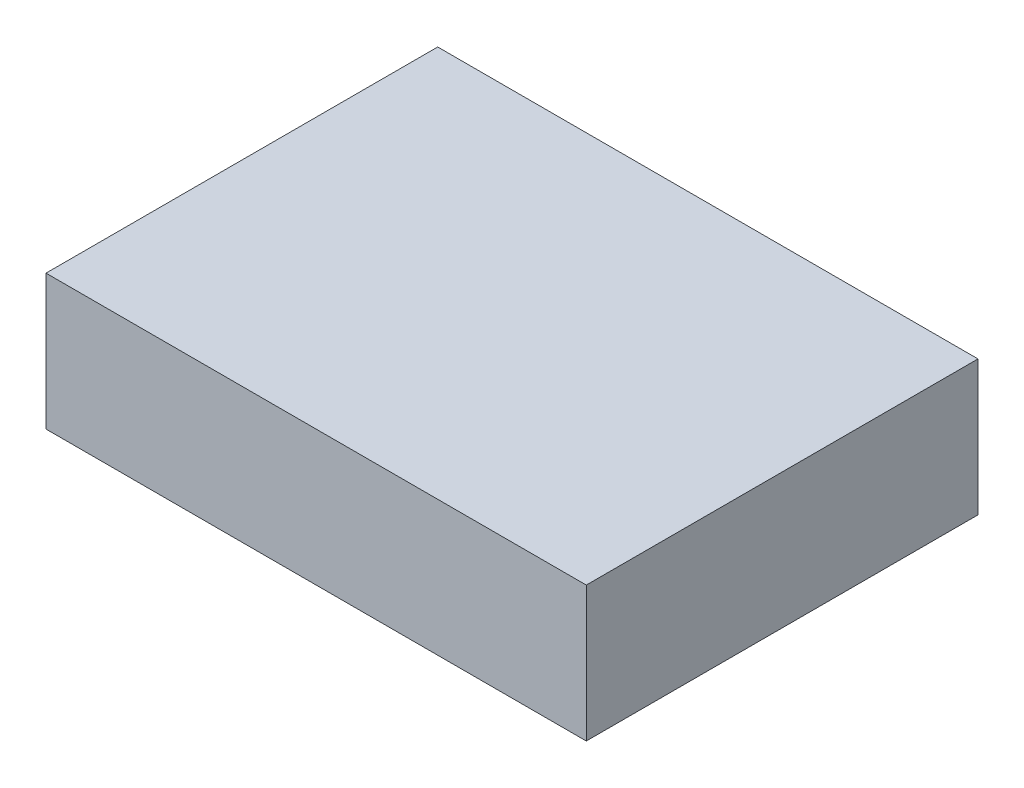
ISO-10303-21;
HEADER;
FILE_DESCRIPTION(('STEP AP214'),'2;1');
FILE_NAME('part.step','',(''),(''),'','','');
FILE_SCHEMA(('AUTOMOTIVE_DESIGN { 1 0 10303 214 1 1 1 1 }'));
ENDSEC;
DATA;
#1=APPLICATION_CONTEXT('core data for automotive mechanical design processes');
#2=APPLICATION_PROTOCOL_DEFINITION('international standard','automotive_design',2000,#1);
#3=PRODUCT_CONTEXT('',#1,'mechanical');
#4=PRODUCT('Part','Part','',(#3));
#5=PRODUCT_RELATED_PRODUCT_CATEGORY('part','',(#4));
#6=PRODUCT_DEFINITION_FORMATION('','',#4);
#7=PRODUCT_DEFINITION_CONTEXT('part definition',#1,'design');
#8=PRODUCT_DEFINITION('design','',#6,#7);
#9=PRODUCT_DEFINITION_SHAPE('','',#8);
#10=(LENGTH_UNIT() NAMED_UNIT(*) SI_UNIT(.MILLI.,.METRE.));
#11=(NAMED_UNIT(*) PLANE_ANGLE_UNIT() SI_UNIT($,.RADIAN.));
#12=(NAMED_UNIT(*) SI_UNIT($,.STERADIAN.) SOLID_ANGLE_UNIT());
#13=UNCERTAINTY_MEASURE_WITH_UNIT(LENGTH_MEASURE(1.E-05),#10,'distance_accuracy_value','');
#14=(GEOMETRIC_REPRESENTATION_CONTEXT(3) GLOBAL_UNCERTAINTY_ASSIGNED_CONTEXT((#13)) GLOBAL_UNIT_ASSIGNED_CONTEXT((#10,
#11,#12)) REPRESENTATION_CONTEXT('',''));
#15=CARTESIAN_POINT('',(0.,0.,0.));
#16=DIRECTION('',(0.,0.,1.));
#17=DIRECTION('',(1.,0.,0.));
#18=AXIS2_PLACEMENT_3D('',#15,#16,#17);
#19=CARTESIAN_POINT('',(0.,10.,0.));
#20=DIRECTION('',(1.,0.,0.));
#21=DIRECTION('',(0.,0.,-1.));
#22=AXIS2_PLACEMENT_3D('',#19,#20,#21);
#23=PLANE('',#22);
#24=DIRECTION('',(0.,0.,1.));
#25=VECTOR('',#24,1.);
#26=CARTESIAN_POINT('',(0.,0.,0.));
#27=LINE('',#26,#25);
#28=CARTESIAN_POINT('',(0.,0.,-29.));
#29=VERTEX_POINT('',#28);
#30=CARTESIAN_POINT('',(0.,0.,0.));
#31=VERTEX_POINT('',#30);
#32=EDGE_CURVE('E105',#29,#31,#27,.T.);
#33=ORIENTED_EDGE('',*,*,#32,.T.);
#34=DIRECTION('',(0.,-1.,0.));
#35=VECTOR('',#34,1.);
#36=CARTESIAN_POINT('',(0.,10.,0.));
#37=LINE('',#36,#35);
#38=CARTESIAN_POINT('',(0.,10.,0.));
#39=VERTEX_POINT('',#38);
#40=EDGE_CURVE('E11',#39,#31,#37,.T.);
#41=ORIENTED_EDGE('',*,*,#40,.F.);
#42=DIRECTION('',(0.,0.,1.));
#43=VECTOR('',#42,1.);
#44=CARTESIAN_POINT('',(0.,10.,0.));
#45=LINE('',#44,#43);
#46=CARTESIAN_POINT('',(0.,10.,-29.));
#47=VERTEX_POINT('',#46);
#48=EDGE_CURVE('E89',#47,#39,#45,.T.);
#49=ORIENTED_EDGE('',*,*,#48,.F.);
#50=DIRECTION('',(0.,-1.,0.));
#51=VECTOR('',#50,1.);
#52=CARTESIAN_POINT('',(0.,10.,-29.));
#53=LINE('',#52,#51);
#54=EDGE_CURVE('E97',#47,#29,#53,.T.);
#55=ORIENTED_EDGE('',*,*,#54,.T.);
#56=EDGE_LOOP('',(#33,#41,#49,#55));
#57=FACE_BOUND('',#56,.T.);
#58=ADVANCED_FACE('F39',(#57),#23,.F.);
#59=CARTESIAN_POINT('',(0.,10.,0.));
#60=DIRECTION('',(0.,0.,-1.));
#61=DIRECTION('',(-1.,0.,0.));
#62=AXIS2_PLACEMENT_3D('',#59,#60,#61);
#63=PLANE('',#62);
#64=DIRECTION('',(1.,0.,0.));
#65=VECTOR('',#64,1.);
#66=CARTESIAN_POINT('',(0.,0.,0.));
#67=LINE('',#66,#65);
#68=CARTESIAN_POINT('',(40.,0.,0.));
#69=VERTEX_POINT('',#68);
#70=EDGE_CURVE('E92',#31,#69,#67,.T.);
#71=ORIENTED_EDGE('',*,*,#70,.T.);
#72=DIRECTION('',(0.,-1.,0.));
#73=VECTOR('',#72,1.);
#74=CARTESIAN_POINT('',(40.,10.,0.));
#75=LINE('',#74,#73);
#76=CARTESIAN_POINT('',(40.,10.,0.));
#77=VERTEX_POINT('',#76);
#78=EDGE_CURVE('E50',#77,#69,#75,.T.);
#79=ORIENTED_EDGE('',*,*,#78,.F.);
#80=DIRECTION('',(1.,0.,0.));
#81=VECTOR('',#80,1.);
#82=CARTESIAN_POINT('',(0.,10.,0.));
#83=LINE('',#82,#81);
#84=EDGE_CURVE('E82',#39,#77,#83,.T.);
#85=ORIENTED_EDGE('',*,*,#84,.F.);
#86=ORIENTED_EDGE('',*,*,#40,.T.);
#87=EDGE_LOOP('',(#71,#79,#85,#86));
#88=FACE_BOUND('',#87,.T.);
#89=ADVANCED_FACE('F93',(#88),#63,.F.);
#90=CARTESIAN_POINT('',(40.,10.,0.));
#91=DIRECTION('',(-1.,0.,0.));
#92=DIRECTION('',(0.,0.,1.));
#93=AXIS2_PLACEMENT_3D('',#90,#91,#92);
#94=PLANE('',#93);
#95=DIRECTION('',(0.,0.,-1.));
#96=VECTOR('',#95,1.);
#97=CARTESIAN_POINT('',(40.,0.,0.));
#98=LINE('',#97,#96);
#99=CARTESIAN_POINT('',(40.,0.,-29.));
#100=VERTEX_POINT('',#99);
#101=EDGE_CURVE('E72',#69,#100,#98,.T.);
#102=ORIENTED_EDGE('',*,*,#101,.T.);
#103=DIRECTION('',(0.,-1.,0.));
#104=VECTOR('',#103,1.);
#105=CARTESIAN_POINT('',(40.,10.,-29.));
#106=LINE('',#105,#104);
#107=CARTESIAN_POINT('',(40.,10.,-29.));
#108=VERTEX_POINT('',#107);
#109=EDGE_CURVE('E94',#108,#100,#106,.T.);
#110=ORIENTED_EDGE('',*,*,#109,.F.);
#111=DIRECTION('',(0.,0.,-1.));
#112=VECTOR('',#111,1.);
#113=CARTESIAN_POINT('',(40.,10.,0.));
#114=LINE('',#113,#112);
#115=EDGE_CURVE('E88',#77,#108,#114,.T.);
#116=ORIENTED_EDGE('',*,*,#115,.F.);
#117=ORIENTED_EDGE('',*,*,#78,.T.);
#118=EDGE_LOOP('',(#102,#110,#116,#117));
#119=FACE_BOUND('',#118,.T.);
#120=ADVANCED_FACE('F96',(#119),#94,.F.);
#121=CARTESIAN_POINT('',(0.,10.,-29.));
#122=DIRECTION('',(0.,0.,1.));
#123=DIRECTION('',(1.,0.,0.));
#124=AXIS2_PLACEMENT_3D('',#121,#122,#123);
#125=PLANE('',#124);
#126=DIRECTION('',(-1.,0.,0.));
#127=VECTOR('',#126,1.);
#128=CARTESIAN_POINT('',(0.,0.,-29.));
#129=LINE('',#128,#127);
#130=EDGE_CURVE('E76',#100,#29,#129,.T.);
#131=ORIENTED_EDGE('',*,*,#130,.T.);
#132=ORIENTED_EDGE('',*,*,#54,.F.);
#133=DIRECTION('',(-1.,0.,0.));
#134=VECTOR('',#133,1.);
#135=CARTESIAN_POINT('',(0.,10.,-29.));
#136=LINE('',#135,#134);
#137=EDGE_CURVE('E54',#108,#47,#136,.T.);
#138=ORIENTED_EDGE('',*,*,#137,.F.);
#139=ORIENTED_EDGE('',*,*,#109,.T.);
#140=EDGE_LOOP('',(#131,#132,#138,#139));
#141=FACE_BOUND('',#140,.T.);
#142=ADVANCED_FACE('F108',(#141),#125,.F.);
#143=CARTESIAN_POINT('',(0.,10.,0.));
#144=DIRECTION('',(0.,-1.,0.));
#145=DIRECTION('',(0.,0.,-1.));
#146=AXIS2_PLACEMENT_3D('',#143,#144,#145);
#147=PLANE('',#146);
#148=ORIENTED_EDGE('',*,*,#48,.T.);
#149=ORIENTED_EDGE('',*,*,#84,.T.);
#150=ORIENTED_EDGE('',*,*,#115,.T.);
#151=ORIENTED_EDGE('',*,*,#137,.T.);
#152=EDGE_LOOP('',(#148,#149,#150,#151));
#153=FACE_BOUND('',#152,.T.);
#154=ADVANCED_FACE('F86',(#153),#147,.F.);
#155=CARTESIAN_POINT('',(0.,0.,0.));
#156=DIRECTION('',(0.,-1.,0.));
#157=DIRECTION('',(0.,0.,-1.));
#158=AXIS2_PLACEMENT_3D('',#155,#156,#157);
#159=PLANE('',#158);
#160=ORIENTED_EDGE('',*,*,#32,.F.);
#161=ORIENTED_EDGE('',*,*,#130,.F.);
#162=ORIENTED_EDGE('',*,*,#101,.F.);
#163=ORIENTED_EDGE('',*,*,#70,.F.);
#164=EDGE_LOOP('',(#160,#161,#162,#163));
#165=FACE_BOUND('',#164,.T.);
#166=ADVANCED_FACE('F115',(#165),#159,.T.);
#167=CLOSED_SHELL('',(#58,#89,#120,#142,#154,#166));
#168=MANIFOLD_SOLID_BREP('B2',#167);
#169=ADVANCED_BREP_SHAPE_REPRESENTATION('',(#18,#168),#14);
#170=SHAPE_DEFINITION_REPRESENTATION(#9,#169);
ENDSEC;
END-ISO-10303-21;
